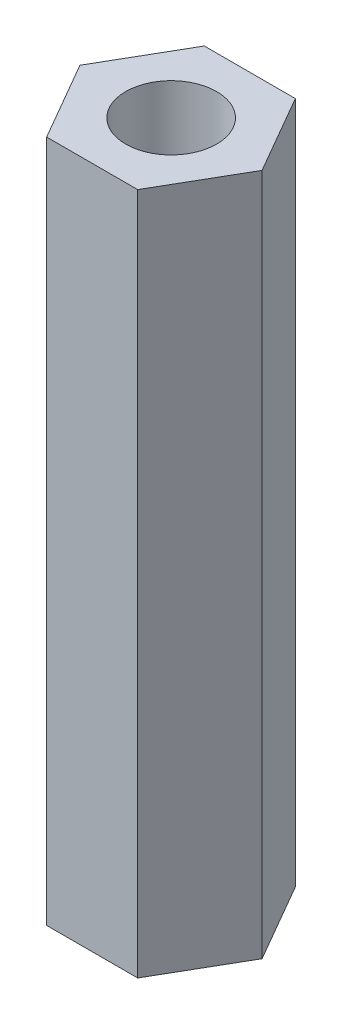
ISO-10303-21;
HEADER;
FILE_DESCRIPTION(('STEP AP214'),'2;1');
FILE_NAME('part.step','',(''),(''),'','','');
FILE_SCHEMA(('AUTOMOTIVE_DESIGN { 1 0 10303 214 1 1 1 1 }'));
ENDSEC;
DATA;
#1=APPLICATION_CONTEXT('core data for automotive mechanical design processes');
#2=APPLICATION_PROTOCOL_DEFINITION('international standard','automotive_design',2000,#1);
#3=PRODUCT_CONTEXT('',#1,'mechanical');
#4=PRODUCT('Part','Part','',(#3));
#5=PRODUCT_RELATED_PRODUCT_CATEGORY('part','',(#4));
#6=PRODUCT_DEFINITION_FORMATION('','',#4);
#7=PRODUCT_DEFINITION_CONTEXT('part definition',#1,'design');
#8=PRODUCT_DEFINITION('design','',#6,#7);
#9=PRODUCT_DEFINITION_SHAPE('','',#8);
#10=(LENGTH_UNIT() NAMED_UNIT(*) SI_UNIT(.MILLI.,.METRE.));
#11=(NAMED_UNIT(*) PLANE_ANGLE_UNIT() SI_UNIT($,.RADIAN.));
#12=(NAMED_UNIT(*) SI_UNIT($,.STERADIAN.) SOLID_ANGLE_UNIT());
#13=UNCERTAINTY_MEASURE_WITH_UNIT(LENGTH_MEASURE(1.E-05),#10,'distance_accuracy_value','');
#14=(GEOMETRIC_REPRESENTATION_CONTEXT(3) GLOBAL_UNCERTAINTY_ASSIGNED_CONTEXT((#13)) GLOBAL_UNIT_ASSIGNED_CONTEXT((#10,
#11,#12)) REPRESENTATION_CONTEXT('',''));
#15=CARTESIAN_POINT('',(0.,0.,0.));
#16=DIRECTION('',(0.,0.,1.));
#17=DIRECTION('',(1.,0.,0.));
#18=AXIS2_PLACEMENT_3D('',#15,#16,#17);
#19=CARTESIAN_POINT('',(0.,-15.,0.));
#20=DIRECTION('',(0.,1.,0.));
#21=DIRECTION('',(0.,0.,1.));
#22=AXIS2_PLACEMENT_3D('',#19,#20,#21);
#23=CYLINDRICAL_SURFACE('',#22,2.);
#24=CARTESIAN_POINT('',(0.,15.,0.));
#25=DIRECTION('',(0.,1.,0.));
#26=DIRECTION('',(0.,0.,1.));
#27=AXIS2_PLACEMENT_3D('',#24,#25,#26);
#28=CIRCLE('',#27,2.);
#29=CARTESIAN_POINT('',(2.,15.,0.));
#30=VERTEX_POINT('',#29);
#31=CARTESIAN_POINT('',(-2.,15.,0.));
#32=VERTEX_POINT('',#31);
#33=EDGE_CURVE('E10',#30,#32,#28,.F.);
#34=ORIENTED_EDGE('',*,*,#33,.F.);
#35=CARTESIAN_POINT('',(0.,15.,0.));
#36=DIRECTION('',(0.,1.,0.));
#37=DIRECTION('',(0.,0.,1.));
#38=AXIS2_PLACEMENT_3D('',#35,#36,#37);
#39=CIRCLE('',#38,2.);
#40=EDGE_CURVE('E113',#32,#30,#39,.F.);
#41=ORIENTED_EDGE('',*,*,#40,.F.);
#42=EDGE_LOOP('',(#34,#41));
#43=FACE_BOUND('',#42,.T.);
#44=CARTESIAN_POINT('',(0.,-15.,0.));
#45=DIRECTION('',(0.,1.,0.));
#46=DIRECTION('',(0.,0.,1.));
#47=AXIS2_PLACEMENT_3D('',#44,#45,#46);
#48=CIRCLE('',#47,2.);
#49=CARTESIAN_POINT('',(2.,-15.,0.));
#50=VERTEX_POINT('',#49);
#51=CARTESIAN_POINT('',(-2.,-15.,0.));
#52=VERTEX_POINT('',#51);
#53=EDGE_CURVE('E19',#50,#52,#48,.F.);
#54=ORIENTED_EDGE('',*,*,#53,.T.);
#55=CARTESIAN_POINT('',(0.,-15.,0.));
#56=DIRECTION('',(0.,1.,0.));
#57=DIRECTION('',(0.,0.,1.));
#58=AXIS2_PLACEMENT_3D('',#55,#56,#57);
#59=CIRCLE('',#58,2.);
#60=EDGE_CURVE('E134',#52,#50,#59,.F.);
#61=ORIENTED_EDGE('',*,*,#60,.T.);
#62=EDGE_LOOP('',(#54,#61));
#63=FACE_BOUND('',#62,.T.);
#64=ADVANCED_FACE('F15',(#43,#63),#23,.F.);
#65=CARTESIAN_POINT('',(1.995272947503,-15.,3.466144344561));
#66=DIRECTION('',(0.866025403784429,0.,0.500000000000017));
#67=DIRECTION('',(0.500000000000017,0.,-0.866025403784429));
#68=AXIS2_PLACEMENT_3D('',#65,#66,#67);
#69=PLANE('',#68);
#70=DIRECTION('',(0.500000000000017,0.,-0.866025403784429));
#71=VECTOR('',#70,1.);
#72=CARTESIAN_POINT('',(2.99527294750312,-15.,1.73409353699199));
#73=LINE('',#72,#71);
#74=CARTESIAN_POINT('',(1.995272947503,-15.,3.466144344561));
#75=VERTEX_POINT('',#74);
#76=CARTESIAN_POINT('',(3.99527294750324,-15.,0.00204272942298056));
#77=VERTEX_POINT('',#76);
#78=EDGE_CURVE('E50',#75,#77,#73,.T.);
#79=ORIENTED_EDGE('',*,*,#78,.T.);
#80=DIRECTION('',(0.,1.,0.));
#81=VECTOR('',#80,1.);
#82=CARTESIAN_POINT('',(3.99527294750324,0.,0.00204272942298056));
#83=LINE('',#82,#81);
#84=CARTESIAN_POINT('',(3.99527294750324,15.,0.00204272942298056));
#85=VERTEX_POINT('',#84);
#86=EDGE_CURVE('E278',#77,#85,#83,.T.);
#87=ORIENTED_EDGE('',*,*,#86,.T.);
#88=DIRECTION('',(0.500000000000017,0.,-0.866025403784429));
#89=VECTOR('',#88,1.);
#90=CARTESIAN_POINT('',(2.99527294750312,15.,1.73409353699199));
#91=LINE('',#90,#89);
#92=CARTESIAN_POINT('',(1.995272947503,15.,3.466144344561));
#93=VERTEX_POINT('',#92);
#94=EDGE_CURVE('E281',#93,#85,#91,.T.);
#95=ORIENTED_EDGE('',*,*,#94,.F.);
#96=DIRECTION('',(0.,1.,0.));
#97=VECTOR('',#96,1.);
#98=CARTESIAN_POINT('',(1.995272947503,0.,3.466144344561));
#99=LINE('',#98,#97);
#100=EDGE_CURVE('E26',#75,#93,#99,.T.);
#101=ORIENTED_EDGE('',*,*,#100,.F.);
#102=EDGE_LOOP('',(#79,#87,#95,#101));
#103=FACE_BOUND('',#102,.T.);
#104=ADVANCED_FACE('F144',(#103),#69,.T.);
#105=CARTESIAN_POINT('',(3.995272947503,-15.,0.002042729422841));
#106=DIRECTION('',(0.866025403784429,0.,-0.500000000000017));
#107=DIRECTION('',(-0.500000000000017,0.,-0.866025403784429));
#108=AXIS2_PLACEMENT_3D('',#105,#106,#107);
#109=PLANE('',#108);
#110=DIRECTION('',(-0.500000000000017,0.,-0.866025403784429));
#111=VECTOR('',#110,1.);
#112=CARTESIAN_POINT('',(2.99527294750295,-15.,-1.73000807814605));
#113=LINE('',#112,#111);
#114=CARTESIAN_POINT('',(1.99527294750289,-15.,-3.46205888571494));
#115=VERTEX_POINT('',#114);
#116=EDGE_CURVE('E124',#77,#115,#113,.T.);
#117=ORIENTED_EDGE('',*,*,#116,.T.);
#118=DIRECTION('',(0.,1.,0.));
#119=VECTOR('',#118,1.);
#120=CARTESIAN_POINT('',(1.99527294750289,0.,-3.46205888571494));
#121=LINE('',#120,#119);
#122=CARTESIAN_POINT('',(1.99527294750289,15.,-3.46205888571494));
#123=VERTEX_POINT('',#122);
#124=EDGE_CURVE('E271',#115,#123,#121,.T.);
#125=ORIENTED_EDGE('',*,*,#124,.T.);
#126=DIRECTION('',(-0.500000000000017,0.,-0.866025403784429));
#127=VECTOR('',#126,1.);
#128=CARTESIAN_POINT('',(2.99527294750295,15.,-1.73000807814605));
#129=LINE('',#128,#127);
#130=EDGE_CURVE('E274',#85,#123,#129,.T.);
#131=ORIENTED_EDGE('',*,*,#130,.F.);
#132=ORIENTED_EDGE('',*,*,#86,.F.);
#133=EDGE_LOOP('',(#117,#125,#131,#132));
#134=FACE_BOUND('',#133,.T.);
#135=ADVANCED_FACE('F149',(#134),#109,.T.);
#136=CARTESIAN_POINT('',(1.995272947503,-15.,-3.462058885715));
#137=DIRECTION('',(0.,0.,-1.));
#138=DIRECTION('',(-1.,0.,0.));
#139=AXIS2_PLACEMENT_3D('',#136,#137,#138);
#140=PLANE('',#139);
#141=DIRECTION('',(-1.,0.,0.));
#142=VECTOR('',#141,1.);
#143=CARTESIAN_POINT('',(-0.0047270524970004,-15.,-3.462058885715));
#144=LINE('',#143,#142);
#145=CARTESIAN_POINT('',(-2.004727052497,-15.,-3.462058885715));
#146=VERTEX_POINT('',#145);
#147=EDGE_CURVE('E127',#115,#146,#144,.T.);
#148=ORIENTED_EDGE('',*,*,#147,.T.);
#149=DIRECTION('',(0.,1.,0.));
#150=VECTOR('',#149,1.);
#151=CARTESIAN_POINT('',(-2.004727052497,0.,-3.462058885715));
#152=LINE('',#151,#150);
#153=CARTESIAN_POINT('',(-2.004727052497,15.,-3.462058885715));
#154=VERTEX_POINT('',#153);
#155=EDGE_CURVE('E259',#146,#154,#152,.T.);
#156=ORIENTED_EDGE('',*,*,#155,.T.);
#157=DIRECTION('',(-1.,0.,0.));
#158=VECTOR('',#157,1.);
#159=CARTESIAN_POINT('',(-0.0047270524970004,15.,-3.462058885715));
#160=LINE('',#159,#158);
#161=EDGE_CURVE('E268',#123,#154,#160,.T.);
#162=ORIENTED_EDGE('',*,*,#161,.F.);
#163=ORIENTED_EDGE('',*,*,#124,.F.);
#164=EDGE_LOOP('',(#148,#156,#162,#163));
#165=FACE_BOUND('',#164,.T.);
#166=ADVANCED_FACE('F155',(#165),#140,.T.);
#167=CARTESIAN_POINT('',(-2.004727052497,-15.,-3.462058885715));
#168=DIRECTION('',(-0.866025403784429,0.,-0.500000000000017));
#169=DIRECTION('',(-0.500000000000017,0.,0.866025403784429));
#170=AXIS2_PLACEMENT_3D('',#167,#168,#169);
#171=PLANE('',#170);
#172=DIRECTION('',(-0.500000000000017,0.,0.866025403784429));
#173=VECTOR('',#172,1.);
#174=CARTESIAN_POINT('',(-3.00472705249705,-15.,-1.73000807814611));
#175=LINE('',#174,#173);
#176=CARTESIAN_POINT('',(-4.00472705249711,-15.,0.00204272942277983));
#177=VERTEX_POINT('',#176);
#178=EDGE_CURVE('E130',#146,#177,#175,.T.);
#179=ORIENTED_EDGE('',*,*,#178,.T.);
#180=DIRECTION('',(0.,1.,0.));
#181=VECTOR('',#180,1.);
#182=CARTESIAN_POINT('',(-4.00472705249711,0.,0.00204272942277983));
#183=LINE('',#182,#181);
#184=CARTESIAN_POINT('',(-4.00472705249711,15.,0.00204272942277983));
#185=VERTEX_POINT('',#184);
#186=EDGE_CURVE('E108',#177,#185,#183,.T.);
#187=ORIENTED_EDGE('',*,*,#186,.T.);
#188=DIRECTION('',(-0.500000000000017,0.,0.866025403784429));
#189=VECTOR('',#188,1.);
#190=CARTESIAN_POINT('',(-3.00472705249705,15.,-1.73000807814611));
#191=LINE('',#190,#189);
#192=EDGE_CURVE('E106',#154,#185,#191,.T.);
#193=ORIENTED_EDGE('',*,*,#192,.F.);
#194=ORIENTED_EDGE('',*,*,#155,.F.);
#195=EDGE_LOOP('',(#179,#187,#193,#194));
#196=FACE_BOUND('',#195,.T.);
#197=ADVANCED_FACE('F159',(#196),#171,.T.);
#198=CARTESIAN_POINT('',(-4.004727052497,-15.,0.00204272942284));
#199=DIRECTION('',(-0.866025403784429,0.,0.500000000000017));
#200=DIRECTION('',(0.500000000000017,0.,0.866025403784429));
#201=AXIS2_PLACEMENT_3D('',#198,#199,#200);
#202=PLANE('',#201);
#203=DIRECTION('',(0.500000000000017,0.,0.866025403784429));
#204=VECTOR('',#203,1.);
#205=CARTESIAN_POINT('',(-3.00472705249688,-15.,1.73409353699185));
#206=LINE('',#205,#204);
#207=CARTESIAN_POINT('',(-2.00472705249676,-15.,3.46614434456086));
#208=VERTEX_POINT('',#207);
#209=EDGE_CURVE('E91',#177,#208,#206,.T.);
#210=ORIENTED_EDGE('',*,*,#209,.T.);
#211=DIRECTION('',(0.,1.,0.));
#212=VECTOR('',#211,1.);
#213=CARTESIAN_POINT('',(-2.00472705249676,0.,3.46614434456086));
#214=LINE('',#213,#212);
#215=CARTESIAN_POINT('',(-2.00472705249676,15.,3.46614434456086));
#216=VERTEX_POINT('',#215);
#217=EDGE_CURVE('E85',#208,#216,#214,.T.);
#218=ORIENTED_EDGE('',*,*,#217,.T.);
#219=DIRECTION('',(0.500000000000017,0.,0.866025403784429));
#220=VECTOR('',#219,1.);
#221=CARTESIAN_POINT('',(-3.00472705249688,15.,1.73409353699185));
#222=LINE('',#221,#220);
#223=EDGE_CURVE('E89',#185,#216,#222,.T.);
#224=ORIENTED_EDGE('',*,*,#223,.F.);
#225=ORIENTED_EDGE('',*,*,#186,.F.);
#226=EDGE_LOOP('',(#210,#218,#224,#225));
#227=FACE_BOUND('',#226,.T.);
#228=ADVANCED_FACE('F87',(#227),#202,.T.);
#229=CARTESIAN_POINT('',(-2.004727052497,-15.,3.466144344561));
#230=DIRECTION('',(0.,0.,1.));
#231=DIRECTION('',(1.,0.,0.));
#232=AXIS2_PLACEMENT_3D('',#229,#230,#231);
#233=PLANE('',#232);
#234=DIRECTION('',(1.,0.,0.));
#235=VECTOR('',#234,1.);
#236=CARTESIAN_POINT('',(-0.00472705249700018,-15.,3.466144344561));
#237=LINE('',#236,#235);
#238=EDGE_CURVE('E118',#208,#75,#237,.T.);
#239=ORIENTED_EDGE('',*,*,#238,.T.);
#240=ORIENTED_EDGE('',*,*,#100,.T.);
#241=DIRECTION('',(1.,0.,0.));
#242=VECTOR('',#241,1.);
#243=CARTESIAN_POINT('',(-0.00472705249700018,15.,3.466144344561));
#244=LINE('',#243,#242);
#245=EDGE_CURVE('E96',#216,#93,#244,.T.);
#246=ORIENTED_EDGE('',*,*,#245,.F.);
#247=ORIENTED_EDGE('',*,*,#217,.F.);
#248=EDGE_LOOP('',(#239,#240,#246,#247));
#249=FACE_BOUND('',#248,.T.);
#250=ADVANCED_FACE('F111',(#249),#233,.T.);
#251=CARTESIAN_POINT('',(0.,15.,0.));
#252=DIRECTION('',(0.,1.,0.));
#253=DIRECTION('',(0.,0.,1.));
#254=AXIS2_PLACEMENT_3D('',#251,#252,#253);
#255=PLANE('',#254);
#256=ORIENTED_EDGE('',*,*,#245,.T.);
#257=ORIENTED_EDGE('',*,*,#94,.T.);
#258=ORIENTED_EDGE('',*,*,#130,.T.);
#259=ORIENTED_EDGE('',*,*,#161,.T.);
#260=ORIENTED_EDGE('',*,*,#192,.T.);
#261=ORIENTED_EDGE('',*,*,#223,.T.);
#262=EDGE_LOOP('',(#256,#257,#258,#259,#260,#261));
#263=FACE_BOUND('',#262,.T.);
#264=ORIENTED_EDGE('',*,*,#40,.T.);
#265=ORIENTED_EDGE('',*,*,#33,.T.);
#266=EDGE_LOOP('',(#264,#265));
#267=FACE_BOUND('',#266,.T.);
#268=ADVANCED_FACE('F101',(#263,#267),#255,.T.);
#269=CARTESIAN_POINT('',(0.,-15.,0.));
#270=DIRECTION('',(0.,1.,0.));
#271=DIRECTION('',(0.,0.,1.));
#272=AXIS2_PLACEMENT_3D('',#269,#270,#271);
#273=PLANE('',#272);
#274=ORIENTED_EDGE('',*,*,#238,.F.);
#275=ORIENTED_EDGE('',*,*,#209,.F.);
#276=ORIENTED_EDGE('',*,*,#178,.F.);
#277=ORIENTED_EDGE('',*,*,#147,.F.);
#278=ORIENTED_EDGE('',*,*,#116,.F.);
#279=ORIENTED_EDGE('',*,*,#78,.F.);
#280=EDGE_LOOP('',(#274,#275,#276,#277,#278,#279));
#281=FACE_BOUND('',#280,.T.);
#282=ORIENTED_EDGE('',*,*,#60,.F.);
#283=ORIENTED_EDGE('',*,*,#53,.F.);
#284=EDGE_LOOP('',(#282,#283));
#285=FACE_BOUND('',#284,.T.);
#286=ADVANCED_FACE('F17',(#281,#285),#273,.F.);
#287=CLOSED_SHELL('',(#64,#104,#135,#166,#197,#228,#250,#268,#286));
#288=MANIFOLD_SOLID_BREP('B1',#287);
#289=ADVANCED_BREP_SHAPE_REPRESENTATION('',(#18,#288),#14);
#290=SHAPE_DEFINITION_REPRESENTATION(#9,#289);
ENDSEC;
END-ISO-10303-21;
